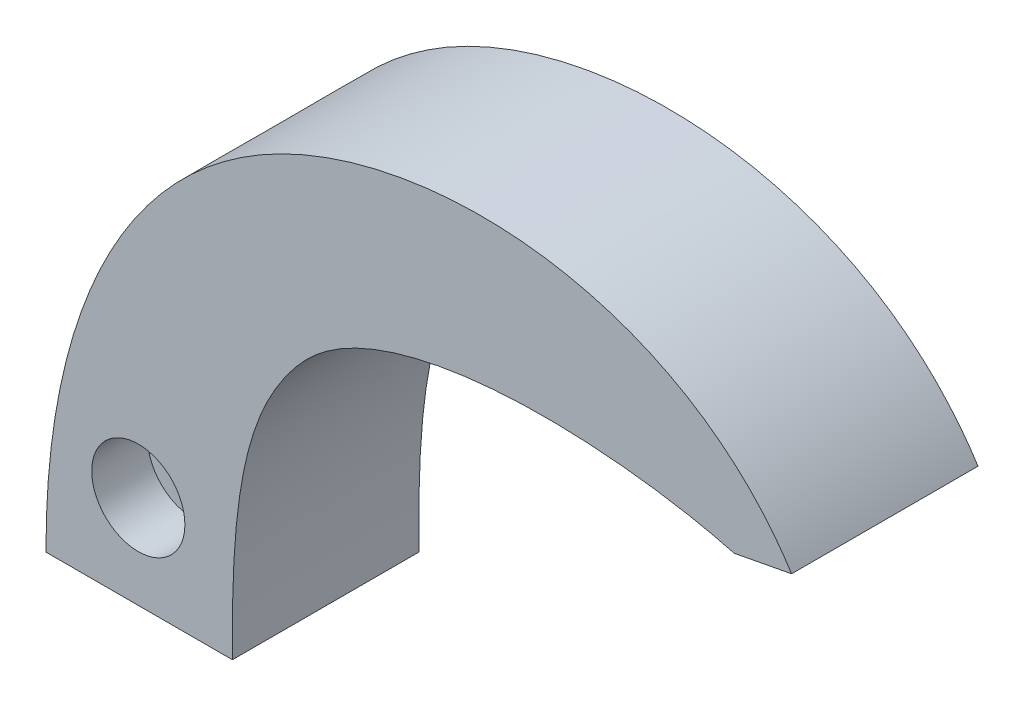
ISO-10303-21;
HEADER;
FILE_DESCRIPTION(('STEP AP214'),'2;1');
FILE_NAME('part.step','',(''),(''),'','','');
FILE_SCHEMA(('AUTOMOTIVE_DESIGN { 1 0 10303 214 1 1 1 1 }'));
ENDSEC;
DATA;
#1=APPLICATION_CONTEXT('core data for automotive mechanical design processes');
#2=APPLICATION_PROTOCOL_DEFINITION('international standard','automotive_design',2000,#1);
#3=PRODUCT_CONTEXT('',#1,'mechanical');
#4=PRODUCT('Part','Part','',(#3));
#5=PRODUCT_RELATED_PRODUCT_CATEGORY('part','',(#4));
#6=PRODUCT_DEFINITION_FORMATION('','',#4);
#7=PRODUCT_DEFINITION_CONTEXT('part definition',#1,'design');
#8=PRODUCT_DEFINITION('design','',#6,#7);
#9=PRODUCT_DEFINITION_SHAPE('','',#8);
#10=(LENGTH_UNIT() NAMED_UNIT(*) SI_UNIT(.MILLI.,.METRE.));
#11=(NAMED_UNIT(*) PLANE_ANGLE_UNIT() SI_UNIT($,.RADIAN.));
#12=(NAMED_UNIT(*) SI_UNIT($,.STERADIAN.) SOLID_ANGLE_UNIT());
#13=UNCERTAINTY_MEASURE_WITH_UNIT(LENGTH_MEASURE(1.E-05),#10,'distance_accuracy_value','');
#14=(GEOMETRIC_REPRESENTATION_CONTEXT(3) GLOBAL_UNCERTAINTY_ASSIGNED_CONTEXT((#13)) GLOBAL_UNIT_ASSIGNED_CONTEXT((#10,
#11,#12)) REPRESENTATION_CONTEXT('',''));
#15=CARTESIAN_POINT('',(0.,0.,0.));
#16=DIRECTION('',(0.,0.,1.));
#17=DIRECTION('',(1.,0.,0.));
#18=AXIS2_PLACEMENT_3D('',#15,#16,#17);
#19=CARTESIAN_POINT('',(10.,0.,10.));
#20=CARTESIAN_POINT('',(9.9214893256917,7.14854684672924,10.));
#21=CARTESIAN_POINT('',(10.713934517916,12.3332836876968,10.));
#22=CARTESIAN_POINT('',(18.7586935700046,21.3760350509107,10.));
#23=CARTESIAN_POINT('',(34.3630194172638,19.8984378332867,10.));
#24=CARTESIAN_POINT('',(40.,17.3515110106951,10.));
#25=B_SPLINE_CURVE_WITH_KNOTS('',3,(#19,#20,#21,#22,#23,#24),.UNSPECIFIED.,.F.,.F.,(4,1,1,4),
(0.,0.3376287694029,0.409350914681329,1.),.UNSPECIFIED.);
#26=DIRECTION('',(0.,0.,-1.));
#27=VECTOR('',#26,1.);
#28=SURFACE_OF_LINEAR_EXTRUSION('',#25,#27);
#29=DIRECTION('',(0.,0.,-1.));
#30=VECTOR('',#29,1.);
#31=CARTESIAN_POINT('',(36.9253581862516,18.408031116926,77.6159574649898));
#32=LINE('',#31,#30);
#33=CARTESIAN_POINT('',(36.9253581862516,18.408031116926,9.99999999999999));
#34=VERTEX_POINT('',#33);
#35=CARTESIAN_POINT('',(36.9253582032084,18.408031112415,0.));
#36=VERTEX_POINT('',#35);
#37=EDGE_CURVE('E57',#34,#36,#32,.T.);
#38=ORIENTED_EDGE('',*,*,#37,.F.);
#39=CARTESIAN_POINT('',(10.,0.,10.));
#40=VERTEX_POINT('',#39);
#41=EDGE_CURVE('E121',#40,#34,#25,.T.);
#42=ORIENTED_EDGE('',*,*,#41,.F.);
#43=DIRECTION('',(0.,0.,-1.));
#44=VECTOR('',#43,1.);
#45=CARTESIAN_POINT('',(10.,0.,10.));
#46=LINE('',#45,#44);
#47=CARTESIAN_POINT('',(10.,0.,0.));
#48=VERTEX_POINT('',#47);
#49=EDGE_CURVE('E49',#40,#48,#46,.T.);
#50=ORIENTED_EDGE('',*,*,#49,.T.);
#51=CARTESIAN_POINT('',(10.,0.,0.));
#52=CARTESIAN_POINT('',(9.9214893256917,7.14854684672924,0.));
#53=CARTESIAN_POINT('',(10.713934517916,12.3332836876968,0.));
#54=CARTESIAN_POINT('',(18.7586935700046,21.3760350509107,0.));
#55=CARTESIAN_POINT('',(34.3630194172638,19.8984378332867,0.));
#56=CARTESIAN_POINT('',(40.,17.3515110106951,0.));
#57=B_SPLINE_CURVE_WITH_KNOTS('',3,(#51,#52,#53,#54,#55,#56),.UNSPECIFIED.,.F.,.F.,(4,1,1,4),
(0.,0.3376287694029,0.409350914681329,1.),.UNSPECIFIED.);
#58=EDGE_CURVE('E89',#48,#36,#57,.T.);
#59=ORIENTED_EDGE('',*,*,#58,.T.);
#60=EDGE_LOOP('',(#38,#42,#50,#59));
#61=FACE_BOUND('',#60,.T.);
#62=ADVANCED_FACE('F38',(#61),#28,.F.);
#63=CARTESIAN_POINT('',(13.4073771265754,25.1904746323829,10.));
#64=DIRECTION('',(0.,0.,1.));
#65=DIRECTION('',(1.,0.,0.));
#66=AXIS2_PLACEMENT_3D('',#63,#64,#65);
#67=PLANE('',#66);
#68=CARTESIAN_POINT('',(4.95185359032035,5.,10.));
#69=DIRECTION('',(0.,0.,1.));
#70=DIRECTION('',(1.,0.,0.));
#71=AXIS2_PLACEMENT_3D('',#68,#69,#70);
#72=CIRCLE('',#71,2.5);
#73=CARTESIAN_POINT('',(7.45185359032036,5.,10.));
#74=VERTEX_POINT('',#73);
#75=EDGE_CURVE('E194',#74,#74,#72,.T.);
#76=ORIENTED_EDGE('',*,*,#75,.F.);
#77=EDGE_LOOP('',(#76));
#78=FACE_BOUND('',#77,.T.);
#79=ORIENTED_EDGE('',*,*,#41,.T.);
#80=DIRECTION('',(-0.982330027394527,-0.187156932222849,0.));
#81=VECTOR('',#80,1.);
#82=CARTESIAN_POINT('',(40.,18.9938225653169,9.99999999999999));
#83=LINE('',#82,#81);
#84=CARTESIAN_POINT('',(40.,18.9938225653169,9.99999999999999));
#85=VERTEX_POINT('',#84);
#86=EDGE_CURVE('E176',#85,#34,#83,.T.);
#87=ORIENTED_EDGE('',*,*,#86,.F.);
#88=CARTESIAN_POINT('',(0.,0.,10.));
#89=CARTESIAN_POINT('',(-0.0392137662563551,11.1804640650511,10.));
#90=CARTESIAN_POINT('',(8.69921101036928,30.1219537156665,10.));
#91=CARTESIAN_POINT('',(34.0572631464891,28.3373080646722,10.));
#92=CARTESIAN_POINT('',(40.,18.9938225653169,10.));
#93=B_SPLINE_CURVE_WITH_KNOTS('',3,(#88,#89,#90,#91,#92),.UNSPECIFIED.,.F.,.F.,(4,1,4),(0.,
0.468371503329362,1.),.UNSPECIFIED.);
#94=CARTESIAN_POINT('',(0.,0.,10.));
#95=VERTEX_POINT('',#94);
#96=EDGE_CURVE('E91',#95,#85,#93,.T.);
#97=ORIENTED_EDGE('',*,*,#96,.F.);
#98=DIRECTION('',(1.,0.,0.));
#99=VECTOR('',#98,1.);
#100=CARTESIAN_POINT('',(0.,0.,10.));
#101=LINE('',#100,#99);
#102=EDGE_CURVE('E80',#95,#40,#101,.T.);
#103=ORIENTED_EDGE('',*,*,#102,.T.);
#104=EDGE_LOOP('',(#79,#87,#97,#103));
#105=FACE_BOUND('',#104,.T.);
#106=ADVANCED_FACE('F141',(#78,#105),#67,.T.);
#107=CARTESIAN_POINT('',(4.95185359032035,5.,0.));
#108=DIRECTION('',(0.,0.,1.));
#109=DIRECTION('',(1.,0.,0.));
#110=AXIS2_PLACEMENT_3D('',#107,#108,#109);
#111=CYLINDRICAL_SURFACE('',#110,1.5);
#112=CARTESIAN_POINT('',(4.95185359032035,5.,7.));
#113=DIRECTION('',(0.,0.,1.));
#114=DIRECTION('',(1.,0.,0.));
#115=AXIS2_PLACEMENT_3D('',#112,#113,#114);
#116=CIRCLE('',#115,1.5);
#117=CARTESIAN_POINT('',(6.45185359032035,5.,7.));
#118=VERTEX_POINT('',#117);
#119=EDGE_CURVE('E97',#118,#118,#116,.F.);
#120=ORIENTED_EDGE('',*,*,#119,.F.);
#121=EDGE_LOOP('',(#120));
#122=FACE_BOUND('',#121,.T.);
#123=CARTESIAN_POINT('',(4.95185359032035,5.,3.));
#124=DIRECTION('',(0.,0.,-1.));
#125=DIRECTION('',(-1.,0.,0.));
#126=AXIS2_PLACEMENT_3D('',#123,#124,#125);
#127=CIRCLE('',#126,1.5);
#128=CARTESIAN_POINT('',(3.45185359032035,5.,3.));
#129=VERTEX_POINT('',#128);
#130=EDGE_CURVE('E43',#129,#129,#127,.F.);
#131=ORIENTED_EDGE('',*,*,#130,.F.);
#132=EDGE_LOOP('',(#131));
#133=FACE_BOUND('',#132,.T.);
#134=ADVANCED_FACE('F151',(#122,#133),#111,.F.);
#135=DIRECTION('',(0.,0.,-1.));
#136=VECTOR('',#135,1.);
#137=SURFACE_OF_LINEAR_EXTRUSION('',#93,#136);
#138=CARTESIAN_POINT('',(0.,0.,0.));
#139=CARTESIAN_POINT('',(-0.0392137662563551,11.1804640650511,0.));
#140=CARTESIAN_POINT('',(8.69921101036928,30.1219537156665,0.));
#141=CARTESIAN_POINT('',(34.0572631464891,28.3373080646722,0.));
#142=CARTESIAN_POINT('',(40.,18.9938225653169,0.));
#143=B_SPLINE_CURVE_WITH_KNOTS('',3,(#138,#139,#140,#141,#142),.UNSPECIFIED.,.F.,.F.,(4,1,4),
(0.,0.468371503329362,1.),.UNSPECIFIED.);
#144=CARTESIAN_POINT('',(0.,0.,0.));
#145=VERTEX_POINT('',#144);
#146=CARTESIAN_POINT('',(40.,18.9938225653169,0.));
#147=VERTEX_POINT('',#146);
#148=EDGE_CURVE('E87',#145,#147,#143,.T.);
#149=ORIENTED_EDGE('',*,*,#148,.F.);
#150=DIRECTION('',(0.,0.,-1.));
#151=VECTOR('',#150,1.);
#152=CARTESIAN_POINT('',(0.,0.,10.));
#153=LINE('',#152,#151);
#154=EDGE_CURVE('E11',#95,#145,#153,.T.);
#155=ORIENTED_EDGE('',*,*,#154,.F.);
#156=ORIENTED_EDGE('',*,*,#96,.T.);
#157=DIRECTION('',(0.,0.,-1.));
#158=VECTOR('',#157,1.);
#159=CARTESIAN_POINT('',(40.,18.9938225653169,10.));
#160=LINE('',#159,#158);
#161=EDGE_CURVE('E95',#85,#147,#160,.T.);
#162=ORIENTED_EDGE('',*,*,#161,.T.);
#163=EDGE_LOOP('',(#149,#155,#156,#162));
#164=FACE_BOUND('',#163,.T.);
#165=ADVANCED_FACE('F40',(#164),#137,.T.);
#166=CARTESIAN_POINT('',(0.,0.,10.));
#167=DIRECTION('',(0.,1.,0.));
#168=DIRECTION('',(0.,0.,1.));
#169=AXIS2_PLACEMENT_3D('',#166,#167,#168);
#170=PLANE('',#169);
#171=DIRECTION('',(1.,0.,0.));
#172=VECTOR('',#171,1.);
#173=CARTESIAN_POINT('',(0.,0.,0.));
#174=LINE('',#173,#172);
#175=EDGE_CURVE('E78',#145,#48,#174,.T.);
#176=ORIENTED_EDGE('',*,*,#175,.T.);
#177=ORIENTED_EDGE('',*,*,#49,.F.);
#178=ORIENTED_EDGE('',*,*,#102,.F.);
#179=ORIENTED_EDGE('',*,*,#154,.T.);
#180=EDGE_LOOP('',(#176,#177,#178,#179));
#181=FACE_BOUND('',#180,.T.);
#182=ADVANCED_FACE('F76',(#181),#170,.F.);
#183=CARTESIAN_POINT('',(13.4073771265754,25.1904746323829,0.));
#184=DIRECTION('',(0.,0.,1.));
#185=DIRECTION('',(1.,0.,0.));
#186=AXIS2_PLACEMENT_3D('',#183,#184,#185);
#187=PLANE('',#186);
#188=CARTESIAN_POINT('',(4.95185359032035,5.,0.));
#189=DIRECTION('',(0.,0.,-1.));
#190=DIRECTION('',(-1.,0.,0.));
#191=AXIS2_PLACEMENT_3D('',#188,#189,#190);
#192=CIRCLE('',#191,2.5);
#193=CARTESIAN_POINT('',(2.45185359032035,5.,0.));
#194=VERTEX_POINT('',#193);
#195=EDGE_CURVE('E179',#194,#194,#192,.T.);
#196=ORIENTED_EDGE('',*,*,#195,.F.);
#197=EDGE_LOOP('',(#196));
#198=FACE_BOUND('',#197,.T.);
#199=ORIENTED_EDGE('',*,*,#148,.T.);
#200=DIRECTION('',(-0.982330027394527,-0.187156932222849,0.));
#201=VECTOR('',#200,1.);
#202=CARTESIAN_POINT('',(40.,18.9938225653169,0.));
#203=LINE('',#202,#201);
#204=EDGE_CURVE('E177',#147,#36,#203,.T.);
#205=ORIENTED_EDGE('',*,*,#204,.T.);
#206=ORIENTED_EDGE('',*,*,#58,.F.);
#207=ORIENTED_EDGE('',*,*,#175,.F.);
#208=EDGE_LOOP('',(#199,#205,#206,#207));
#209=FACE_BOUND('',#208,.T.);
#210=ADVANCED_FACE('F85',(#198,#209),#187,.F.);
#211=CARTESIAN_POINT('',(4.95185359032035,5.,7.));
#212=DIRECTION('',(0.,0.,1.));
#213=DIRECTION('',(1.,0.,0.));
#214=AXIS2_PLACEMENT_3D('',#211,#212,#213);
#215=PLANE('',#214);
#216=CARTESIAN_POINT('',(4.95185359032035,5.,7.));
#217=DIRECTION('',(0.,0.,1.));
#218=DIRECTION('',(1.,0.,0.));
#219=AXIS2_PLACEMENT_3D('',#216,#217,#218);
#220=CIRCLE('',#219,2.5);
#221=CARTESIAN_POINT('',(7.45185359032036,5.,7.));
#222=VERTEX_POINT('',#221);
#223=EDGE_CURVE('E103',#222,#222,#220,.T.);
#224=ORIENTED_EDGE('',*,*,#223,.T.);
#225=EDGE_LOOP('',(#224));
#226=FACE_BOUND('',#225,.T.);
#227=ORIENTED_EDGE('',*,*,#119,.T.);
#228=EDGE_LOOP('',(#227));
#229=FACE_BOUND('',#228,.T.);
#230=ADVANCED_FACE('F147',(#226,#229),#215,.T.);
#231=CARTESIAN_POINT('',(4.95185359032035,5.,7.));
#232=DIRECTION('',(0.,0.,1.));
#233=DIRECTION('',(1.,0.,0.));
#234=AXIS2_PLACEMENT_3D('',#231,#232,#233);
#235=CYLINDRICAL_SURFACE('',#234,2.5);
#236=ORIENTED_EDGE('',*,*,#223,.F.);
#237=EDGE_LOOP('',(#236));
#238=FACE_BOUND('',#237,.T.);
#239=ORIENTED_EDGE('',*,*,#75,.T.);
#240=EDGE_LOOP('',(#239));
#241=FACE_BOUND('',#240,.T.);
#242=ADVANCED_FACE('F156',(#238,#241),#235,.F.);
#243=CARTESIAN_POINT('',(4.95185359032035,5.,3.));
#244=DIRECTION('',(0.,0.,-1.));
#245=DIRECTION('',(-1.,0.,0.));
#246=AXIS2_PLACEMENT_3D('',#243,#244,#245);
#247=PLANE('',#246);
#248=CARTESIAN_POINT('',(4.95185359032035,5.,3.));
#249=DIRECTION('',(0.,0.,-1.));
#250=DIRECTION('',(-1.,0.,0.));
#251=AXIS2_PLACEMENT_3D('',#248,#249,#250);
#252=CIRCLE('',#251,2.5);
#253=CARTESIAN_POINT('',(2.45185359032035,5.,3.));
#254=VERTEX_POINT('',#253);
#255=EDGE_CURVE('E184',#254,#254,#252,.T.);
#256=ORIENTED_EDGE('',*,*,#255,.T.);
#257=EDGE_LOOP('',(#256));
#258=FACE_BOUND('',#257,.T.);
#259=ORIENTED_EDGE('',*,*,#130,.T.);
#260=EDGE_LOOP('',(#259));
#261=FACE_BOUND('',#260,.T.);
#262=ADVANCED_FACE('F159',(#258,#261),#247,.T.);
#263=CARTESIAN_POINT('',(4.95185359032035,5.,3.));
#264=DIRECTION('',(0.,0.,-1.));
#265=DIRECTION('',(-1.,0.,0.));
#266=AXIS2_PLACEMENT_3D('',#263,#264,#265);
#267=CYLINDRICAL_SURFACE('',#266,2.5);
#268=ORIENTED_EDGE('',*,*,#255,.F.);
#269=EDGE_LOOP('',(#268));
#270=FACE_BOUND('',#269,.T.);
#271=ORIENTED_EDGE('',*,*,#195,.T.);
#272=EDGE_LOOP('',(#271));
#273=FACE_BOUND('',#272,.T.);
#274=ADVANCED_FACE('F164',(#270,#273),#267,.F.);
#275=CARTESIAN_POINT('',(40.,18.9938225653169,77.6159574649898));
#276=DIRECTION('',(0.187156932222849,-0.982330027394527,0.));
#277=DIRECTION('',(0.982330027394527,0.187156932222849,0.));
#278=AXIS2_PLACEMENT_3D('',#275,#276,#277);
#279=PLANE('',#278);
#280=ORIENTED_EDGE('',*,*,#161,.F.);
#281=ORIENTED_EDGE('',*,*,#86,.T.);
#282=ORIENTED_EDGE('',*,*,#37,.T.);
#283=ORIENTED_EDGE('',*,*,#204,.F.);
#284=EDGE_LOOP('',(#280,#281,#282,#283));
#285=FACE_BOUND('',#284,.T.);
#286=ADVANCED_FACE('F167',(#285),#279,.T.);
#287=CLOSED_SHELL('',(#62,#106,#134,#165,#182,#210,#230,#242,#262,#274,#286));
#288=MANIFOLD_SOLID_BREP('B2',#287);
#289=ADVANCED_BREP_SHAPE_REPRESENTATION('',(#18,#288),#14);
#290=SHAPE_DEFINITION_REPRESENTATION(#9,#289);
ENDSEC;
END-ISO-10303-21;
